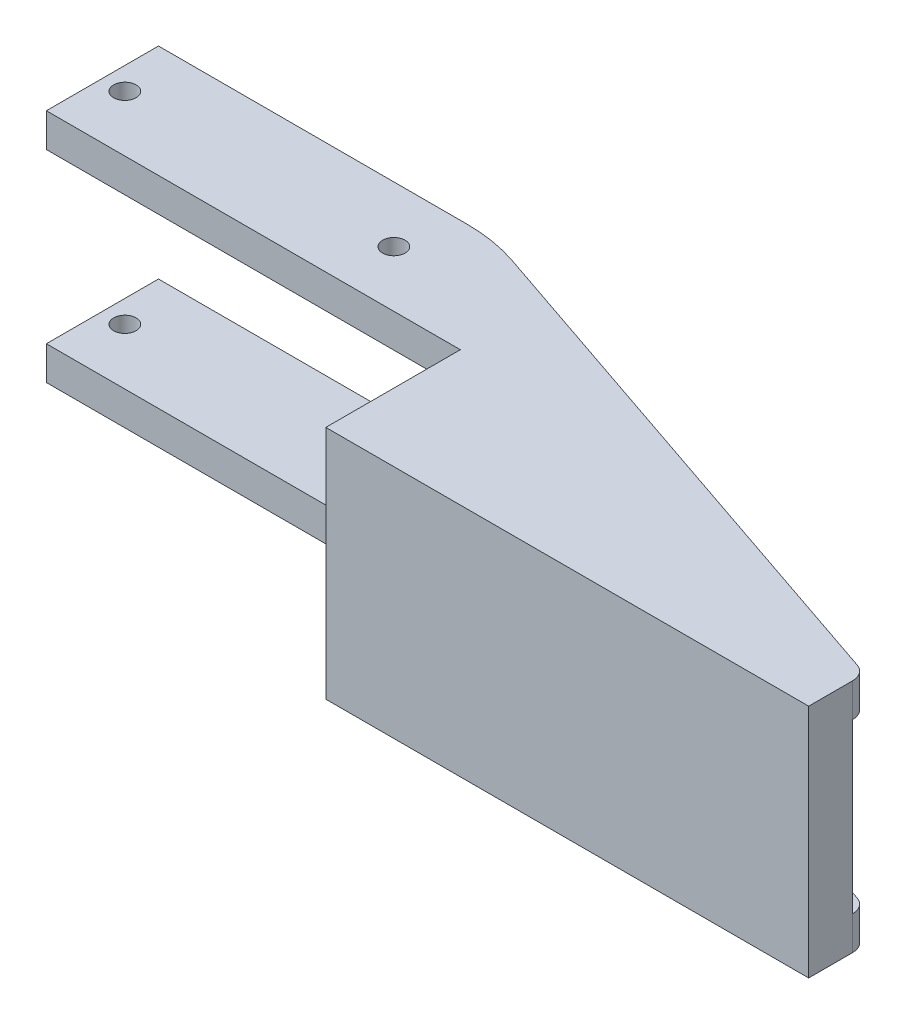
ISO-10303-21;
HEADER;
FILE_DESCRIPTION(('STEP AP214'),'2;1');
FILE_NAME('part.step','',(''),(''),'','','');
FILE_SCHEMA(('AUTOMOTIVE_DESIGN { 1 0 10303 214 1 1 1 1 }'));
ENDSEC;
DATA;
#1=APPLICATION_CONTEXT('core data for automotive mechanical design processes');
#2=APPLICATION_PROTOCOL_DEFINITION('international standard','automotive_design',2000,#1);
#3=PRODUCT_CONTEXT('',#1,'mechanical');
#4=PRODUCT('Part','Part','',(#3));
#5=PRODUCT_RELATED_PRODUCT_CATEGORY('part','',(#4));
#6=PRODUCT_DEFINITION_FORMATION('','',#4);
#7=PRODUCT_DEFINITION_CONTEXT('part definition',#1,'design');
#8=PRODUCT_DEFINITION('design','',#6,#7);
#9=PRODUCT_DEFINITION_SHAPE('','',#8);
#10=(LENGTH_UNIT() NAMED_UNIT(*) SI_UNIT(.MILLI.,.METRE.));
#11=(NAMED_UNIT(*) PLANE_ANGLE_UNIT() SI_UNIT($,.RADIAN.));
#12=(NAMED_UNIT(*) SI_UNIT($,.STERADIAN.) SOLID_ANGLE_UNIT());
#13=UNCERTAINTY_MEASURE_WITH_UNIT(LENGTH_MEASURE(1.E-05),#10,'distance_accuracy_value','');
#14=(GEOMETRIC_REPRESENTATION_CONTEXT(3) GLOBAL_UNCERTAINTY_ASSIGNED_CONTEXT((#13)) GLOBAL_UNIT_ASSIGNED_CONTEXT((#10,
#11,#12)) REPRESENTATION_CONTEXT('',''));
#15=CARTESIAN_POINT('',(0.,0.,0.));
#16=DIRECTION('',(0.,0.,1.));
#17=DIRECTION('',(1.,0.,0.));
#18=AXIS2_PLACEMENT_3D('',#15,#16,#17);
#19=CARTESIAN_POINT('',(-9.406467809383,0.,4.84529828109201));
#20=DIRECTION('',(0.,-1.,0.));
#21=DIRECTION('',(0.,0.,-1.));
#22=AXIS2_PLACEMENT_3D('',#19,#20,#21);
#23=PLANE('',#22);
#24=CARTESIAN_POINT('',(-10.9261880687563,0.,-5.15470171890799));
#25=DIRECTION('',(0.,-1.,0.));
#26=DIRECTION('',(0.,0.,-1.));
#27=AXIS2_PLACEMENT_3D('',#24,#25,#26);
#28=CIRCLE('',#27,0.999999999999992);
#29=CARTESIAN_POINT('',(-10.9261880687563,0.,-6.15470171890798));
#30=VERTEX_POINT('',#29);
#31=EDGE_CURVE('E143',#30,#30,#28,.T.);
#32=ORIENTED_EDGE('',*,*,#31,.T.);
#33=EDGE_LOOP('',(#32));
#34=FACE_BOUND('',#33,.T.);
#35=CARTESIAN_POINT('',(-34.9261880687563,0.,-5.15470171890799));
#36=DIRECTION('',(0.,-1.,0.));
#37=DIRECTION('',(0.,0.,-1.));
#38=AXIS2_PLACEMENT_3D('',#35,#36,#37);
#39=CIRCLE('',#38,0.99999999999999);
#40=CARTESIAN_POINT('',(-34.9261880687563,0.,-6.15470171890798));
#41=VERTEX_POINT('',#40);
#42=EDGE_CURVE('E192',#41,#41,#39,.T.);
#43=ORIENTED_EDGE('',*,*,#42,.T.);
#44=EDGE_LOOP('',(#43));
#45=FACE_BOUND('',#44,.T.);
#46=DIRECTION('',(-1.,0.,0.));
#47=VECTOR('',#46,1.);
#48=CARTESIAN_POINT('',(0.,0.,7.91962779227332));
#49=LINE('',#48,#47);
#50=CARTESIAN_POINT('',(43.0738119312437,0.,7.91962779227332));
#51=VERTEX_POINT('',#50);
#52=CARTESIAN_POINT('',(0.,0.,7.91962779227332));
#53=VERTEX_POINT('',#52);
#54=EDGE_CURVE('E180',#51,#53,#49,.T.);
#55=ORIENTED_EDGE('',*,*,#54,.F.);
#56=CARTESIAN_POINT('',(41.5738119312437,0.,7.91962779227332));
#57=DIRECTION('',(0.,1.,0.));
#58=DIRECTION('',(0.,0.,-1.));
#59=AXIS2_PLACEMENT_3D('',#56,#57,#58);
#60=CIRCLE('',#59,1.5);
#61=CARTESIAN_POINT('',(42.0566660311017,0.,6.49946867504375));
#62=VERTEX_POINT('',#61);
#63=EDGE_CURVE('E139',#51,#62,#60,.T.);
#64=ORIENTED_EDGE('',*,*,#63,.T.);
#65=DIRECTION('',(-0.946772744819713,0.,-0.321902733238702));
#66=VECTOR('',#65,1.);
#67=CARTESIAN_POINT('',(-4.57792681080247,0.,-9.35629289120368));
#68=LINE('',#67,#66);
#69=CARTESIAN_POINT('',(-4.57792681080247,0.,-9.35629289120368));
#70=VERTEX_POINT('',#69);
#71=EDGE_CURVE('E142',#62,#70,#68,.T.);
#72=ORIENTED_EDGE('',*,*,#71,.T.);
#73=CARTESIAN_POINT('',(-9.406467809383,0.,4.84529828109201));
#74=DIRECTION('',(0.,1.,0.));
#75=DIRECTION('',(0.,0.,-1.));
#76=AXIS2_PLACEMENT_3D('',#73,#74,#75);
#77=CIRCLE('',#76,15.);
#78=CARTESIAN_POINT('',(-9.406467809383,0.,-10.154701718908));
#79=VERTEX_POINT('',#78);
#80=EDGE_CURVE('E146',#70,#79,#77,.T.);
#81=ORIENTED_EDGE('',*,*,#80,.T.);
#82=DIRECTION('',(-1.,0.,0.));
#83=VECTOR('',#82,1.);
#84=CARTESIAN_POINT('',(-36.9261880687563,0.,-10.154701718908));
#85=LINE('',#84,#83);
#86=CARTESIAN_POINT('',(-36.9261880687563,0.,-10.154701718908));
#87=VERTEX_POINT('',#86);
#88=EDGE_CURVE('E149',#79,#87,#85,.T.);
#89=ORIENTED_EDGE('',*,*,#88,.T.);
#90=DIRECTION('',(0.,0.,1.));
#91=VECTOR('',#90,1.);
#92=CARTESIAN_POINT('',(-36.9261880687563,0.,-10.154701718908));
#93=LINE('',#92,#91);
#94=CARTESIAN_POINT('',(-36.9261880687563,0.,-0.154701718907987));
#95=VERTEX_POINT('',#94);
#96=EDGE_CURVE('E152',#87,#95,#93,.T.);
#97=ORIENTED_EDGE('',*,*,#96,.T.);
#98=DIRECTION('',(1.,0.,0.));
#99=VECTOR('',#98,1.);
#100=CARTESIAN_POINT('',(-36.9261880687563,0.,-0.154701718907987));
#101=LINE('',#100,#99);
#102=CARTESIAN_POINT('',(0.,0.,-0.154701718907987));
#103=VERTEX_POINT('',#102);
#104=EDGE_CURVE('E155',#95,#103,#101,.T.);
#105=ORIENTED_EDGE('',*,*,#104,.T.);
#106=DIRECTION('',(0.,0.,1.));
#107=VECTOR('',#106,1.);
#108=CARTESIAN_POINT('',(0.,0.,11.845298281092));
#109=LINE('',#108,#107);
#110=EDGE_CURVE('E120',#103,#53,#109,.T.);
#111=ORIENTED_EDGE('',*,*,#110,.T.);
#112=EDGE_LOOP('',(#55,#64,#72,#81,#89,#97,#105,#111));
#113=FACE_BOUND('',#112,.T.);
#114=ADVANCED_FACE('F34',(#34,#45,#113),#23,.F.);
#115=CARTESIAN_POINT('',(43.0738119312437,-3.,7.91962779227332));
#116=DIRECTION('',(1.,0.,0.));
#117=DIRECTION('',(0.,0.,-1.));
#118=AXIS2_PLACEMENT_3D('',#115,#116,#117);
#119=PLANE('',#118);
#120=DIRECTION('',(0.,1.,0.));
#121=VECTOR('',#120,1.);
#122=CARTESIAN_POINT('',(43.0738119312437,-3.,7.91962779227332));
#123=LINE('',#122,#121);
#124=CARTESIAN_POINT('',(43.0738119312437,-3.,7.91962779227332));
#125=VERTEX_POINT('',#124);
#126=EDGE_CURVE('E38',#125,#51,#123,.T.);
#127=ORIENTED_EDGE('',*,*,#126,.T.);
#128=DIRECTION('',(0.,-1.,0.));
#129=VECTOR('',#128,1.);
#130=CARTESIAN_POINT('',(43.0738119312437,58.2523313021961,7.91962779227332));
#131=LINE('',#130,#129);
#132=CARTESIAN_POINT('',(43.0738119312437,15.,7.91962779227332));
#133=VERTEX_POINT('',#132);
#134=EDGE_CURVE('E171',#133,#51,#131,.T.);
#135=ORIENTED_EDGE('',*,*,#134,.F.);
#136=DIRECTION('',(0.,-1.,0.));
#137=VECTOR('',#136,1.);
#138=CARTESIAN_POINT('',(43.0738119312437,18.,7.91962779227332));
#139=LINE('',#138,#137);
#140=CARTESIAN_POINT('',(43.0738119312437,18.,7.91962779227332));
#141=VERTEX_POINT('',#140);
#142=EDGE_CURVE('E287',#141,#133,#139,.T.);
#143=ORIENTED_EDGE('',*,*,#142,.F.);
#144=DIRECTION('',(0.,0.,-1.));
#145=VECTOR('',#144,1.);
#146=CARTESIAN_POINT('',(43.0738119312437,18.,7.91962779227332));
#147=LINE('',#146,#145);
#148=CARTESIAN_POINT('',(43.0738119312437,18.,11.845298281092));
#149=VERTEX_POINT('',#148);
#150=EDGE_CURVE('E270',#149,#141,#147,.T.);
#151=ORIENTED_EDGE('',*,*,#150,.F.);
#152=DIRECTION('',(0.,1.,0.));
#153=VECTOR('',#152,1.);
#154=CARTESIAN_POINT('',(43.0738119312437,-3.,11.845298281092));
#155=LINE('',#154,#153);
#156=CARTESIAN_POINT('',(43.0738119312437,-3.,11.845298281092));
#157=VERTEX_POINT('',#156);
#158=EDGE_CURVE('E11',#157,#149,#155,.T.);
#159=ORIENTED_EDGE('',*,*,#158,.F.);
#160=DIRECTION('',(0.,0.,-1.));
#161=VECTOR('',#160,1.);
#162=CARTESIAN_POINT('',(43.0738119312437,-3.,7.91962779227332));
#163=LINE('',#162,#161);
#164=EDGE_CURVE('E157',#157,#125,#163,.T.);
#165=ORIENTED_EDGE('',*,*,#164,.T.);
#166=EDGE_LOOP('',(#127,#135,#143,#151,#159,#165));
#167=FACE_BOUND('',#166,.T.);
#168=ADVANCED_FACE('F36',(#167),#119,.T.);
#169=CARTESIAN_POINT('',(0.,-3.,11.845298281092));
#170=DIRECTION('',(0.,0.,1.));
#171=DIRECTION('',(1.,0.,0.));
#172=AXIS2_PLACEMENT_3D('',#169,#170,#171);
#173=PLANE('',#172);
#174=ORIENTED_EDGE('',*,*,#158,.T.);
#175=DIRECTION('',(1.,0.,0.));
#176=VECTOR('',#175,1.);
#177=CARTESIAN_POINT('',(0.,18.,11.845298281092));
#178=LINE('',#177,#176);
#179=CARTESIAN_POINT('',(0.,18.,11.845298281092));
#180=VERTEX_POINT('',#179);
#181=EDGE_CURVE('E226',#180,#149,#178,.T.);
#182=ORIENTED_EDGE('',*,*,#181,.F.);
#183=DIRECTION('',(0.,1.,0.));
#184=VECTOR('',#183,1.);
#185=CARTESIAN_POINT('',(0.,-3.,11.845298281092));
#186=LINE('',#185,#184);
#187=CARTESIAN_POINT('',(0.,-3.,11.845298281092));
#188=VERTEX_POINT('',#187);
#189=EDGE_CURVE('E44',#188,#180,#186,.T.);
#190=ORIENTED_EDGE('',*,*,#189,.F.);
#191=DIRECTION('',(1.,0.,0.));
#192=VECTOR('',#191,1.);
#193=CARTESIAN_POINT('',(0.,-3.,11.845298281092));
#194=LINE('',#193,#192);
#195=EDGE_CURVE('E129',#188,#157,#194,.T.);
#196=ORIENTED_EDGE('',*,*,#195,.T.);
#197=EDGE_LOOP('',(#174,#182,#190,#196));
#198=FACE_BOUND('',#197,.T.);
#199=ADVANCED_FACE('F221',(#198),#173,.T.);
#200=CARTESIAN_POINT('',(0.,-3.,11.845298281092));
#201=DIRECTION('',(-1.,0.,0.));
#202=DIRECTION('',(0.,0.,1.));
#203=AXIS2_PLACEMENT_3D('',#200,#201,#202);
#204=PLANE('',#203);
#205=ORIENTED_EDGE('',*,*,#110,.F.);
#206=DIRECTION('',(0.,1.,0.));
#207=VECTOR('',#206,1.);
#208=CARTESIAN_POINT('',(0.,-3.,-0.154701718907987));
#209=LINE('',#208,#207);
#210=CARTESIAN_POINT('',(0.,-3.,-0.154701718907987));
#211=VERTEX_POINT('',#210);
#212=EDGE_CURVE('E86',#211,#103,#209,.T.);
#213=ORIENTED_EDGE('',*,*,#212,.F.);
#214=DIRECTION('',(0.,0.,1.));
#215=VECTOR('',#214,1.);
#216=CARTESIAN_POINT('',(0.,-3.,11.845298281092));
#217=LINE('',#216,#215);
#218=EDGE_CURVE('E116',#211,#188,#217,.T.);
#219=ORIENTED_EDGE('',*,*,#218,.T.);
#220=ORIENTED_EDGE('',*,*,#189,.T.);
#221=DIRECTION('',(0.,0.,1.));
#222=VECTOR('',#221,1.);
#223=CARTESIAN_POINT('',(0.,18.,11.845298281092));
#224=LINE('',#223,#222);
#225=CARTESIAN_POINT('',(0.,18.,-0.154701718907987));
#226=VERTEX_POINT('',#225);
#227=EDGE_CURVE('E231',#226,#180,#224,.T.);
#228=ORIENTED_EDGE('',*,*,#227,.F.);
#229=DIRECTION('',(0.,-1.,0.));
#230=VECTOR('',#229,1.);
#231=CARTESIAN_POINT('',(0.,18.,-0.154701718907987));
#232=LINE('',#231,#230);
#233=CARTESIAN_POINT('',(0.,15.,-0.154701718907987));
#234=VERTEX_POINT('',#233);
#235=EDGE_CURVE('E242',#226,#234,#232,.T.);
#236=ORIENTED_EDGE('',*,*,#235,.T.);
#237=DIRECTION('',(0.,0.,1.));
#238=VECTOR('',#237,1.);
#239=CARTESIAN_POINT('',(0.,15.,11.845298281092));
#240=LINE('',#239,#238);
#241=CARTESIAN_POINT('',(0.,15.,7.91962779227332));
#242=VERTEX_POINT('',#241);
#243=EDGE_CURVE('E267',#234,#242,#240,.T.);
#244=ORIENTED_EDGE('',*,*,#243,.T.);
#245=DIRECTION('',(0.,-1.,0.));
#246=VECTOR('',#245,1.);
#247=CARTESIAN_POINT('',(0.,58.2523313021961,7.91962779227332));
#248=LINE('',#247,#246);
#249=EDGE_CURVE('E183',#242,#53,#248,.T.);
#250=ORIENTED_EDGE('',*,*,#249,.T.);
#251=EDGE_LOOP('',(#205,#213,#219,#220,#228,#236,#244,#250));
#252=FACE_BOUND('',#251,.T.);
#253=ADVANCED_FACE('F114',(#252),#204,.T.);
#254=CARTESIAN_POINT('',(-36.9261880687563,-3.,-0.154701718907987));
#255=DIRECTION('',(0.,0.,1.));
#256=DIRECTION('',(1.,0.,0.));
#257=AXIS2_PLACEMENT_3D('',#254,#255,#256);
#258=PLANE('',#257);
#259=ORIENTED_EDGE('',*,*,#104,.F.);
#260=DIRECTION('',(0.,1.,0.));
#261=VECTOR('',#260,1.);
#262=CARTESIAN_POINT('',(-36.9261880687563,-3.,-0.154701718907987));
#263=LINE('',#262,#261);
#264=CARTESIAN_POINT('',(-36.9261880687563,-3.,-0.154701718907987));
#265=VERTEX_POINT('',#264);
#266=EDGE_CURVE('E79',#265,#95,#263,.T.);
#267=ORIENTED_EDGE('',*,*,#266,.F.);
#268=DIRECTION('',(1.,0.,0.));
#269=VECTOR('',#268,1.);
#270=CARTESIAN_POINT('',(-36.9261880687563,-3.,-0.154701718907987));
#271=LINE('',#270,#269);
#272=EDGE_CURVE('E127',#265,#211,#271,.T.);
#273=ORIENTED_EDGE('',*,*,#272,.T.);
#274=ORIENTED_EDGE('',*,*,#212,.T.);
#275=EDGE_LOOP('',(#259,#267,#273,#274));
#276=FACE_BOUND('',#275,.T.);
#277=ADVANCED_FACE('F131',(#276),#258,.T.);
#278=CARTESIAN_POINT('',(-36.9261880687563,-3.,-10.154701718908));
#279=DIRECTION('',(-1.,0.,0.));
#280=DIRECTION('',(0.,0.,1.));
#281=AXIS2_PLACEMENT_3D('',#278,#279,#280);
#282=PLANE('',#281);
#283=ORIENTED_EDGE('',*,*,#96,.F.);
#284=DIRECTION('',(0.,1.,0.));
#285=VECTOR('',#284,1.);
#286=CARTESIAN_POINT('',(-36.9261880687563,-3.,-10.154701718908));
#287=LINE('',#286,#285);
#288=CARTESIAN_POINT('',(-36.9261880687563,-3.,-10.154701718908));
#289=VERTEX_POINT('',#288);
#290=EDGE_CURVE('E161',#289,#87,#287,.T.);
#291=ORIENTED_EDGE('',*,*,#290,.F.);
#292=DIRECTION('',(0.,0.,1.));
#293=VECTOR('',#292,1.);
#294=CARTESIAN_POINT('',(-36.9261880687563,-3.,-10.154701718908));
#295=LINE('',#294,#293);
#296=EDGE_CURVE('E132',#289,#265,#295,.T.);
#297=ORIENTED_EDGE('',*,*,#296,.T.);
#298=ORIENTED_EDGE('',*,*,#266,.T.);
#299=EDGE_LOOP('',(#283,#291,#297,#298));
#300=FACE_BOUND('',#299,.T.);
#301=ADVANCED_FACE('F400',(#300),#282,.T.);
#302=CARTESIAN_POINT('',(-36.9261880687563,-3.,-10.154701718908));
#303=DIRECTION('',(0.,0.,-1.));
#304=DIRECTION('',(-1.,0.,0.));
#305=AXIS2_PLACEMENT_3D('',#302,#303,#304);
#306=PLANE('',#305);
#307=ORIENTED_EDGE('',*,*,#88,.F.);
#308=DIRECTION('',(0.,1.,0.));
#309=VECTOR('',#308,1.);
#310=CARTESIAN_POINT('',(-9.406467809383,-3.,-10.154701718908));
#311=LINE('',#310,#309);
#312=CARTESIAN_POINT('',(-9.406467809383,-3.,-10.154701718908));
#313=VERTEX_POINT('',#312);
#314=EDGE_CURVE('E163',#313,#79,#311,.T.);
#315=ORIENTED_EDGE('',*,*,#314,.F.);
#316=DIRECTION('',(-1.,0.,0.));
#317=VECTOR('',#316,1.);
#318=CARTESIAN_POINT('',(-36.9261880687563,-3.,-10.154701718908));
#319=LINE('',#318,#317);
#320=EDGE_CURVE('E134',#313,#289,#319,.T.);
#321=ORIENTED_EDGE('',*,*,#320,.T.);
#322=ORIENTED_EDGE('',*,*,#290,.T.);
#323=EDGE_LOOP('',(#307,#315,#321,#322));
#324=FACE_BOUND('',#323,.T.);
#325=ADVANCED_FACE('F212',(#324),#306,.T.);
#326=CARTESIAN_POINT('',(-9.406467809383,-3.,4.84529828109201));
#327=DIRECTION('',(0.,1.,0.));
#328=DIRECTION('',(0.,0.,1.));
#329=AXIS2_PLACEMENT_3D('',#326,#327,#328);
#330=CYLINDRICAL_SURFACE('',#329,15.);
#331=ORIENTED_EDGE('',*,*,#80,.F.);
#332=DIRECTION('',(0.,1.,0.));
#333=VECTOR('',#332,1.);
#334=CARTESIAN_POINT('',(-4.57792681080247,-3.,-9.35629289120368));
#335=LINE('',#334,#333);
#336=CARTESIAN_POINT('',(-4.57792681080247,-3.,-9.35629289120368));
#337=VERTEX_POINT('',#336);
#338=EDGE_CURVE('E165',#337,#70,#335,.T.);
#339=ORIENTED_EDGE('',*,*,#338,.F.);
#340=CARTESIAN_POINT('',(-9.406467809383,-3.,4.84529828109201));
#341=DIRECTION('',(0.,1.,0.));
#342=DIRECTION('',(0.,0.,-1.));
#343=AXIS2_PLACEMENT_3D('',#340,#341,#342);
#344=CIRCLE('',#343,15.);
#345=EDGE_CURVE('E206',#337,#313,#344,.T.);
#346=ORIENTED_EDGE('',*,*,#345,.T.);
#347=ORIENTED_EDGE('',*,*,#314,.T.);
#348=EDGE_LOOP('',(#331,#339,#346,#347));
#349=FACE_BOUND('',#348,.T.);
#350=ADVANCED_FACE('F217',(#349),#330,.T.);
#351=CARTESIAN_POINT('',(-4.57792681080247,-3.,-9.35629289120368));
#352=DIRECTION('',(0.321902733238702,0.,-0.946772744819713));
#353=DIRECTION('',(-0.946772744819713,0.,-0.321902733238702));
#354=AXIS2_PLACEMENT_3D('',#351,#352,#353);
#355=PLANE('',#354);
#356=ORIENTED_EDGE('',*,*,#71,.F.);
#357=DIRECTION('',(0.,1.,0.));
#358=VECTOR('',#357,1.);
#359=CARTESIAN_POINT('',(42.0566660311017,-3.,6.49946867504375));
#360=LINE('',#359,#358);
#361=CARTESIAN_POINT('',(42.0566660311017,-3.,6.49946867504375));
#362=VERTEX_POINT('',#361);
#363=EDGE_CURVE('E166',#362,#62,#360,.T.);
#364=ORIENTED_EDGE('',*,*,#363,.F.);
#365=DIRECTION('',(-0.946772744819713,0.,-0.321902733238702));
#366=VECTOR('',#365,1.);
#367=CARTESIAN_POINT('',(-4.57792681080247,-3.,-9.35629289120368));
#368=LINE('',#367,#366);
#369=EDGE_CURVE('E203',#362,#337,#368,.T.);
#370=ORIENTED_EDGE('',*,*,#369,.T.);
#371=ORIENTED_EDGE('',*,*,#338,.T.);
#372=EDGE_LOOP('',(#356,#364,#370,#371));
#373=FACE_BOUND('',#372,.T.);
#374=ADVANCED_FACE('F219',(#373),#355,.T.);
#375=CARTESIAN_POINT('',(41.5738119312437,-3.,7.91962779227332));
#376=DIRECTION('',(0.,1.,0.));
#377=DIRECTION('',(0.,0.,1.));
#378=AXIS2_PLACEMENT_3D('',#375,#376,#377);
#379=CYLINDRICAL_SURFACE('',#378,1.5);
#380=ORIENTED_EDGE('',*,*,#63,.F.);
#381=ORIENTED_EDGE('',*,*,#126,.F.);
#382=CARTESIAN_POINT('',(41.5738119312437,-3.,7.91962779227332));
#383=DIRECTION('',(0.,1.,0.));
#384=DIRECTION('',(0.,0.,-1.));
#385=AXIS2_PLACEMENT_3D('',#382,#383,#384);
#386=CIRCLE('',#385,1.5);
#387=EDGE_CURVE('E201',#125,#362,#386,.T.);
#388=ORIENTED_EDGE('',*,*,#387,.T.);
#389=ORIENTED_EDGE('',*,*,#363,.T.);
#390=EDGE_LOOP('',(#380,#381,#388,#389));
#391=FACE_BOUND('',#390,.T.);
#392=ADVANCED_FACE('F173',(#391),#379,.T.);
#393=CARTESIAN_POINT('',(-9.406467809383,-3.,4.84529828109201));
#394=DIRECTION('',(0.,-1.,0.));
#395=DIRECTION('',(0.,0.,-1.));
#396=AXIS2_PLACEMENT_3D('',#393,#394,#395);
#397=PLANE('',#396);
#398=CARTESIAN_POINT('',(-34.9261880687563,-3.,-5.15470171890799));
#399=DIRECTION('',(0.,-1.,0.));
#400=DIRECTION('',(0.,0.,-1.));
#401=AXIS2_PLACEMENT_3D('',#398,#399,#400);
#402=CIRCLE('',#401,0.999999999999987);
#403=CARTESIAN_POINT('',(-34.9261880687563,-3.,-6.15470171890797));
#404=VERTEX_POINT('',#403);
#405=EDGE_CURVE('E185',#404,#404,#402,.T.);
#406=ORIENTED_EDGE('',*,*,#405,.F.);
#407=EDGE_LOOP('',(#406));
#408=FACE_BOUND('',#407,.T.);
#409=CARTESIAN_POINT('',(-10.9261880687563,-3.,-5.15470171890799));
#410=DIRECTION('',(0.,-1.,0.));
#411=DIRECTION('',(0.,0.,-1.));
#412=AXIS2_PLACEMENT_3D('',#409,#410,#411);
#413=CIRCLE('',#412,0.999999999999987);
#414=CARTESIAN_POINT('',(-10.9261880687563,-3.,-6.15470171890797));
#415=VERTEX_POINT('',#414);
#416=EDGE_CURVE('E195',#415,#415,#413,.T.);
#417=ORIENTED_EDGE('',*,*,#416,.F.);
#418=EDGE_LOOP('',(#417));
#419=FACE_BOUND('',#418,.T.);
#420=ORIENTED_EDGE('',*,*,#164,.F.);
#421=ORIENTED_EDGE('',*,*,#195,.F.);
#422=ORIENTED_EDGE('',*,*,#218,.F.);
#423=ORIENTED_EDGE('',*,*,#272,.F.);
#424=ORIENTED_EDGE('',*,*,#296,.F.);
#425=ORIENTED_EDGE('',*,*,#320,.F.);
#426=ORIENTED_EDGE('',*,*,#345,.F.);
#427=ORIENTED_EDGE('',*,*,#369,.F.);
#428=ORIENTED_EDGE('',*,*,#387,.F.);
#429=EDGE_LOOP('',(#420,#421,#422,#423,#424,#425,#426,#427,#428));
#430=FACE_BOUND('',#429,.T.);
#431=ADVANCED_FACE('F125',(#408,#419,#430),#397,.T.);
#432=CARTESIAN_POINT('',(-10.9261880687563,-3.,-5.15470171890799));
#433=DIRECTION('',(0.,-1.,0.));
#434=DIRECTION('',(0.,0.,-1.));
#435=AXIS2_PLACEMENT_3D('',#432,#433,#434);
#436=CYLINDRICAL_SURFACE('',#435,0.999999999999992);
#437=ORIENTED_EDGE('',*,*,#416,.T.);
#438=EDGE_LOOP('',(#437));
#439=FACE_BOUND('',#438,.T.);
#440=ORIENTED_EDGE('',*,*,#31,.F.);
#441=EDGE_LOOP('',(#440));
#442=FACE_BOUND('',#441,.T.);
#443=ADVANCED_FACE('F412',(#439,#442),#436,.F.);
#444=CARTESIAN_POINT('',(-34.9261880687563,-3.,-5.15470171890799));
#445=DIRECTION('',(0.,-1.,0.));
#446=DIRECTION('',(0.,0.,-1.));
#447=AXIS2_PLACEMENT_3D('',#444,#445,#446);
#448=CYLINDRICAL_SURFACE('',#447,0.99999999999999);
#449=ORIENTED_EDGE('',*,*,#405,.T.);
#450=EDGE_LOOP('',(#449));
#451=FACE_BOUND('',#450,.T.);
#452=ORIENTED_EDGE('',*,*,#42,.F.);
#453=EDGE_LOOP('',(#452));
#454=FACE_BOUND('',#453,.T.);
#455=ADVANCED_FACE('F417',(#451,#454),#448,.F.);
#456=CARTESIAN_POINT('',(0.,58.2523313021961,7.91962779227332));
#457=DIRECTION('',(0.,0.,1.));
#458=DIRECTION('',(1.,0.,0.));
#459=AXIS2_PLACEMENT_3D('',#456,#457,#458);
#460=PLANE('',#459);
#461=ORIENTED_EDGE('',*,*,#249,.F.);
#462=DIRECTION('',(1.,0.,0.));
#463=VECTOR('',#462,1.);
#464=CARTESIAN_POINT('',(0.,15.,7.91962779227332));
#465=LINE('',#464,#463);
#466=EDGE_CURVE('E182',#242,#133,#465,.T.);
#467=ORIENTED_EDGE('',*,*,#466,.T.);
#468=ORIENTED_EDGE('',*,*,#134,.T.);
#469=ORIENTED_EDGE('',*,*,#54,.T.);
#470=EDGE_LOOP('',(#461,#467,#468,#469));
#471=FACE_BOUND('',#470,.T.);
#472=ADVANCED_FACE('F178',(#471),#460,.F.);
#473=CARTESIAN_POINT('',(-9.406467809383,15.,4.84529828109201));
#474=DIRECTION('',(0.,-1.,0.));
#475=DIRECTION('',(0.,0.,-1.));
#476=AXIS2_PLACEMENT_3D('',#473,#474,#475);
#477=PLANE('',#476);
#478=CARTESIAN_POINT('',(-10.9261880687563,15.,-5.15470171890799));
#479=DIRECTION('',(0.,-1.,0.));
#480=DIRECTION('',(0.,0.,-1.));
#481=AXIS2_PLACEMENT_3D('',#478,#479,#480);
#482=CIRCLE('',#481,0.999999999999992);
#483=CARTESIAN_POINT('',(-10.9261880687563,15.,-6.15470171890798));
#484=VERTEX_POINT('',#483);
#485=EDGE_CURVE('E252',#484,#484,#482,.T.);
#486=ORIENTED_EDGE('',*,*,#485,.F.);
#487=EDGE_LOOP('',(#486));
#488=FACE_BOUND('',#487,.T.);
#489=CARTESIAN_POINT('',(-34.9261880687563,15.,-5.15470171890799));
#490=DIRECTION('',(0.,-1.,0.));
#491=DIRECTION('',(0.,0.,-1.));
#492=AXIS2_PLACEMENT_3D('',#489,#490,#491);
#493=CIRCLE('',#492,0.99999999999999);
#494=CARTESIAN_POINT('',(-34.9261880687563,15.,-6.15470171890798));
#495=VERTEX_POINT('',#494);
#496=EDGE_CURVE('E293',#495,#495,#493,.T.);
#497=ORIENTED_EDGE('',*,*,#496,.F.);
#498=EDGE_LOOP('',(#497));
#499=FACE_BOUND('',#498,.T.);
#500=ORIENTED_EDGE('',*,*,#466,.F.);
#501=ORIENTED_EDGE('',*,*,#243,.F.);
#502=DIRECTION('',(1.,0.,0.));
#503=VECTOR('',#502,1.);
#504=CARTESIAN_POINT('',(-36.9261880687563,15.,-0.154701718907987));
#505=LINE('',#504,#503);
#506=CARTESIAN_POINT('',(-36.9261880687563,15.,-0.154701718907987));
#507=VERTEX_POINT('',#506);
#508=EDGE_CURVE('E264',#507,#234,#505,.T.);
#509=ORIENTED_EDGE('',*,*,#508,.F.);
#510=DIRECTION('',(0.,0.,1.));
#511=VECTOR('',#510,1.);
#512=CARTESIAN_POINT('',(-36.9261880687563,15.,-10.154701718908));
#513=LINE('',#512,#511);
#514=CARTESIAN_POINT('',(-36.9261880687563,15.,-10.154701718908));
#515=VERTEX_POINT('',#514);
#516=EDGE_CURVE('E261',#515,#507,#513,.T.);
#517=ORIENTED_EDGE('',*,*,#516,.F.);
#518=DIRECTION('',(-1.,0.,0.));
#519=VECTOR('',#518,1.);
#520=CARTESIAN_POINT('',(-36.9261880687563,15.,-10.154701718908));
#521=LINE('',#520,#519);
#522=CARTESIAN_POINT('',(-9.406467809383,15.,-10.154701718908));
#523=VERTEX_POINT('',#522);
#524=EDGE_CURVE('E258',#523,#515,#521,.T.);
#525=ORIENTED_EDGE('',*,*,#524,.F.);
#526=CARTESIAN_POINT('',(-9.406467809383,15.,4.84529828109201));
#527=DIRECTION('',(0.,1.,0.));
#528=DIRECTION('',(0.,0.,-1.));
#529=AXIS2_PLACEMENT_3D('',#526,#527,#528);
#530=CIRCLE('',#529,15.);
#531=CARTESIAN_POINT('',(-4.57792681080247,15.,-9.35629289120368));
#532=VERTEX_POINT('',#531);
#533=EDGE_CURVE('E255',#532,#523,#530,.T.);
#534=ORIENTED_EDGE('',*,*,#533,.F.);
#535=DIRECTION('',(-0.946772744819713,0.,-0.321902733238702));
#536=VECTOR('',#535,1.);
#537=CARTESIAN_POINT('',(-4.57792681080247,15.,-9.35629289120368));
#538=LINE('',#537,#536);
#539=CARTESIAN_POINT('',(42.0566660311017,15.,6.49946867504375));
#540=VERTEX_POINT('',#539);
#541=EDGE_CURVE('E251',#540,#532,#538,.T.);
#542=ORIENTED_EDGE('',*,*,#541,.F.);
#543=CARTESIAN_POINT('',(41.5738119312437,15.,7.91962779227332));
#544=DIRECTION('',(0.,1.,0.));
#545=DIRECTION('',(0.,0.,-1.));
#546=AXIS2_PLACEMENT_3D('',#543,#544,#545);
#547=CIRCLE('',#546,1.5);
#548=EDGE_CURVE('E248',#133,#540,#547,.T.);
#549=ORIENTED_EDGE('',*,*,#548,.F.);
#550=EDGE_LOOP('',(#500,#501,#509,#517,#525,#534,#542,#549));
#551=FACE_BOUND('',#550,.T.);
#552=ADVANCED_FACE('F338',(#488,#499,#551),#477,.T.);
#553=CARTESIAN_POINT('',(41.5738119312437,18.,7.91962779227332));
#554=DIRECTION('',(0.,-1.,0.));
#555=DIRECTION('',(0.,0.,-1.));
#556=AXIS2_PLACEMENT_3D('',#553,#554,#555);
#557=CYLINDRICAL_SURFACE('',#556,1.5);
#558=ORIENTED_EDGE('',*,*,#548,.T.);
#559=DIRECTION('',(0.,-1.,0.));
#560=VECTOR('',#559,1.);
#561=CARTESIAN_POINT('',(42.0566660311017,18.,6.49946867504375));
#562=LINE('',#561,#560);
#563=CARTESIAN_POINT('',(42.0566660311017,18.,6.49946867504375));
#564=VERTEX_POINT('',#563);
#565=EDGE_CURVE('E284',#564,#540,#562,.T.);
#566=ORIENTED_EDGE('',*,*,#565,.F.);
#567=CARTESIAN_POINT('',(41.5738119312437,18.,7.91962779227332));
#568=DIRECTION('',(0.,1.,0.));
#569=DIRECTION('',(0.,0.,-1.));
#570=AXIS2_PLACEMENT_3D('',#567,#568,#569);
#571=CIRCLE('',#570,1.5);
#572=EDGE_CURVE('E306',#141,#564,#571,.T.);
#573=ORIENTED_EDGE('',*,*,#572,.F.);
#574=ORIENTED_EDGE('',*,*,#142,.T.);
#575=EDGE_LOOP('',(#558,#566,#573,#574));
#576=FACE_BOUND('',#575,.T.);
#577=ADVANCED_FACE('F363',(#576),#557,.T.);
#578=CARTESIAN_POINT('',(-4.57792681080247,18.,-9.35629289120368));
#579=DIRECTION('',(-0.321902733238702,0.,0.946772744819713));
#580=DIRECTION('',(0.946772744819713,0.,0.321902733238702));
#581=AXIS2_PLACEMENT_3D('',#578,#579,#580);
#582=PLANE('',#581);
#583=ORIENTED_EDGE('',*,*,#541,.T.);
#584=DIRECTION('',(0.,-1.,0.));
#585=VECTOR('',#584,1.);
#586=CARTESIAN_POINT('',(-4.57792681080247,18.,-9.35629289120368));
#587=LINE('',#586,#585);
#588=CARTESIAN_POINT('',(-4.57792681080247,18.,-9.35629289120368));
#589=VERTEX_POINT('',#588);
#590=EDGE_CURVE('E281',#589,#532,#587,.T.);
#591=ORIENTED_EDGE('',*,*,#590,.F.);
#592=DIRECTION('',(-0.946772744819713,0.,-0.321902733238702));
#593=VECTOR('',#592,1.);
#594=CARTESIAN_POINT('',(-4.57792681080247,18.,-9.35629289120368));
#595=LINE('',#594,#593);
#596=EDGE_CURVE('E309',#564,#589,#595,.T.);
#597=ORIENTED_EDGE('',*,*,#596,.F.);
#598=ORIENTED_EDGE('',*,*,#565,.T.);
#599=EDGE_LOOP('',(#583,#591,#597,#598));
#600=FACE_BOUND('',#599,.T.);
#601=ADVANCED_FACE('F369',(#600),#582,.F.);
#602=CARTESIAN_POINT('',(-9.406467809383,18.,4.84529828109201));
#603=DIRECTION('',(0.,-1.,0.));
#604=DIRECTION('',(0.,0.,-1.));
#605=AXIS2_PLACEMENT_3D('',#602,#603,#604);
#606=CYLINDRICAL_SURFACE('',#605,15.);
#607=ORIENTED_EDGE('',*,*,#533,.T.);
#608=DIRECTION('',(0.,-1.,0.));
#609=VECTOR('',#608,1.);
#610=CARTESIAN_POINT('',(-9.406467809383,18.,-10.154701718908));
#611=LINE('',#610,#609);
#612=CARTESIAN_POINT('',(-9.406467809383,18.,-10.154701718908));
#613=VERTEX_POINT('',#612);
#614=EDGE_CURVE('E278',#613,#523,#611,.T.);
#615=ORIENTED_EDGE('',*,*,#614,.F.);
#616=CARTESIAN_POINT('',(-9.406467809383,18.,4.84529828109201));
#617=DIRECTION('',(0.,1.,0.));
#618=DIRECTION('',(0.,0.,-1.));
#619=AXIS2_PLACEMENT_3D('',#616,#617,#618);
#620=CIRCLE('',#619,15.);
#621=EDGE_CURVE('E312',#589,#613,#620,.T.);
#622=ORIENTED_EDGE('',*,*,#621,.F.);
#623=ORIENTED_EDGE('',*,*,#590,.T.);
#624=EDGE_LOOP('',(#607,#615,#622,#623));
#625=FACE_BOUND('',#624,.T.);
#626=ADVANCED_FACE('F372',(#625),#606,.T.);
#627=CARTESIAN_POINT('',(-36.9261880687563,18.,-10.154701718908));
#628=DIRECTION('',(0.,0.,1.));
#629=DIRECTION('',(1.,0.,0.));
#630=AXIS2_PLACEMENT_3D('',#627,#628,#629);
#631=PLANE('',#630);
#632=ORIENTED_EDGE('',*,*,#524,.T.);
#633=DIRECTION('',(0.,-1.,0.));
#634=VECTOR('',#633,1.);
#635=CARTESIAN_POINT('',(-36.9261880687563,18.,-10.154701718908));
#636=LINE('',#635,#634);
#637=CARTESIAN_POINT('',(-36.9261880687563,18.,-10.154701718908));
#638=VERTEX_POINT('',#637);
#639=EDGE_CURVE('E275',#638,#515,#636,.T.);
#640=ORIENTED_EDGE('',*,*,#639,.F.);
#641=DIRECTION('',(-1.,0.,0.));
#642=VECTOR('',#641,1.);
#643=CARTESIAN_POINT('',(-36.9261880687563,18.,-10.154701718908));
#644=LINE('',#643,#642);
#645=EDGE_CURVE('E315',#613,#638,#644,.T.);
#646=ORIENTED_EDGE('',*,*,#645,.F.);
#647=ORIENTED_EDGE('',*,*,#614,.T.);
#648=EDGE_LOOP('',(#632,#640,#646,#647));
#649=FACE_BOUND('',#648,.T.);
#650=ADVANCED_FACE('F375',(#649),#631,.F.);
#651=CARTESIAN_POINT('',(-36.9261880687563,18.,-10.154701718908));
#652=DIRECTION('',(1.,0.,0.));
#653=DIRECTION('',(0.,0.,-1.));
#654=AXIS2_PLACEMENT_3D('',#651,#652,#653);
#655=PLANE('',#654);
#656=ORIENTED_EDGE('',*,*,#516,.T.);
#657=DIRECTION('',(0.,-1.,0.));
#658=VECTOR('',#657,1.);
#659=CARTESIAN_POINT('',(-36.9261880687563,18.,-0.154701718907987));
#660=LINE('',#659,#658);
#661=CARTESIAN_POINT('',(-36.9261880687563,18.,-0.154701718907987));
#662=VERTEX_POINT('',#661);
#663=EDGE_CURVE('E272',#662,#507,#660,.T.);
#664=ORIENTED_EDGE('',*,*,#663,.F.);
#665=DIRECTION('',(0.,0.,1.));
#666=VECTOR('',#665,1.);
#667=CARTESIAN_POINT('',(-36.9261880687563,18.,-10.154701718908));
#668=LINE('',#667,#666);
#669=EDGE_CURVE('E244',#638,#662,#668,.T.);
#670=ORIENTED_EDGE('',*,*,#669,.F.);
#671=ORIENTED_EDGE('',*,*,#639,.T.);
#672=EDGE_LOOP('',(#656,#664,#670,#671));
#673=FACE_BOUND('',#672,.T.);
#674=ADVANCED_FACE('F325',(#673),#655,.F.);
#675=CARTESIAN_POINT('',(-36.9261880687563,18.,-0.154701718907987));
#676=DIRECTION('',(0.,0.,-1.));
#677=DIRECTION('',(-1.,0.,0.));
#678=AXIS2_PLACEMENT_3D('',#675,#676,#677);
#679=PLANE('',#678);
#680=ORIENTED_EDGE('',*,*,#508,.T.);
#681=ORIENTED_EDGE('',*,*,#235,.F.);
#682=DIRECTION('',(1.,0.,0.));
#683=VECTOR('',#682,1.);
#684=CARTESIAN_POINT('',(-36.9261880687563,18.,-0.154701718907987));
#685=LINE('',#684,#683);
#686=EDGE_CURVE('E239',#662,#226,#685,.T.);
#687=ORIENTED_EDGE('',*,*,#686,.F.);
#688=ORIENTED_EDGE('',*,*,#663,.T.);
#689=EDGE_LOOP('',(#680,#681,#687,#688));
#690=FACE_BOUND('',#689,.T.);
#691=ADVANCED_FACE('F330',(#690),#679,.F.);
#692=CARTESIAN_POINT('',(-9.406467809383,18.,4.84529828109201));
#693=DIRECTION('',(0.,-1.,0.));
#694=DIRECTION('',(0.,0.,-1.));
#695=AXIS2_PLACEMENT_3D('',#692,#693,#694);
#696=PLANE('',#695);
#697=CARTESIAN_POINT('',(-34.9261880687563,18.,-5.15470171890799));
#698=DIRECTION('',(0.,-1.,0.));
#699=DIRECTION('',(0.,0.,-1.));
#700=AXIS2_PLACEMENT_3D('',#697,#698,#699);
#701=CIRCLE('',#700,0.999999999999994);
#702=CARTESIAN_POINT('',(-34.9261880687563,18.,-6.15470171890798));
#703=VERTEX_POINT('',#702);
#704=EDGE_CURVE('E295',#703,#703,#701,.T.);
#705=ORIENTED_EDGE('',*,*,#704,.T.);
#706=EDGE_LOOP('',(#705));
#707=FACE_BOUND('',#706,.T.);
#708=CARTESIAN_POINT('',(-10.9261880687563,18.,-5.15470171890799));
#709=DIRECTION('',(0.,-1.,0.));
#710=DIRECTION('',(0.,0.,-1.));
#711=AXIS2_PLACEMENT_3D('',#708,#709,#710);
#712=CIRCLE('',#711,0.999999999999997);
#713=CARTESIAN_POINT('',(-10.9261880687563,18.,-6.15470171890798));
#714=VERTEX_POINT('',#713);
#715=EDGE_CURVE('E292',#714,#714,#712,.T.);
#716=ORIENTED_EDGE('',*,*,#715,.T.);
#717=EDGE_LOOP('',(#716));
#718=FACE_BOUND('',#717,.T.);
#719=ORIENTED_EDGE('',*,*,#150,.T.);
#720=ORIENTED_EDGE('',*,*,#572,.T.);
#721=ORIENTED_EDGE('',*,*,#596,.T.);
#722=ORIENTED_EDGE('',*,*,#621,.T.);
#723=ORIENTED_EDGE('',*,*,#645,.T.);
#724=ORIENTED_EDGE('',*,*,#669,.T.);
#725=ORIENTED_EDGE('',*,*,#686,.T.);
#726=ORIENTED_EDGE('',*,*,#227,.T.);
#727=ORIENTED_EDGE('',*,*,#181,.T.);
#728=EDGE_LOOP('',(#719,#720,#721,#722,#723,#724,#725,#726,#727));
#729=FACE_BOUND('',#728,.T.);
#730=ADVANCED_FACE('F236',(#707,#718,#729),#696,.F.);
#731=CARTESIAN_POINT('',(-10.9261880687563,-3.,-5.15470171890799));
#732=DIRECTION('',(0.,-1.,0.));
#733=DIRECTION('',(0.,0.,-1.));
#734=AXIS2_PLACEMENT_3D('',#731,#732,#733);
#735=CYLINDRICAL_SURFACE('',#734,0.999999999999992);
#736=ORIENTED_EDGE('',*,*,#485,.T.);
#737=EDGE_LOOP('',(#736));
#738=FACE_BOUND('',#737,.T.);
#739=ORIENTED_EDGE('',*,*,#715,.F.);
#740=EDGE_LOOP('',(#739));
#741=FACE_BOUND('',#740,.T.);
#742=ADVANCED_FACE('F473',(#738,#741),#735,.F.);
#743=CARTESIAN_POINT('',(-34.9261880687563,-3.,-5.15470171890799));
#744=DIRECTION('',(0.,-1.,0.));
#745=DIRECTION('',(0.,0.,-1.));
#746=AXIS2_PLACEMENT_3D('',#743,#744,#745);
#747=CYLINDRICAL_SURFACE('',#746,0.99999999999999);
#748=ORIENTED_EDGE('',*,*,#496,.T.);
#749=EDGE_LOOP('',(#748));
#750=FACE_BOUND('',#749,.T.);
#751=ORIENTED_EDGE('',*,*,#704,.F.);
#752=EDGE_LOOP('',(#751));
#753=FACE_BOUND('',#752,.T.);
#754=ADVANCED_FACE('F482',(#750,#753),#747,.F.);
#755=CLOSED_SHELL('',(#114,#168,#199,#253,#277,#301,#325,#350,#374,#392,#431,#443,#455,#472,
#552,#577,#601,#626,#650,#674,#691,#730,#742,#754));
#756=MANIFOLD_SOLID_BREP('B2',#755);
#757=ADVANCED_BREP_SHAPE_REPRESENTATION('',(#18,#756),#14);
#758=SHAPE_DEFINITION_REPRESENTATION(#9,#757);
ENDSEC;
END-ISO-10303-21;
